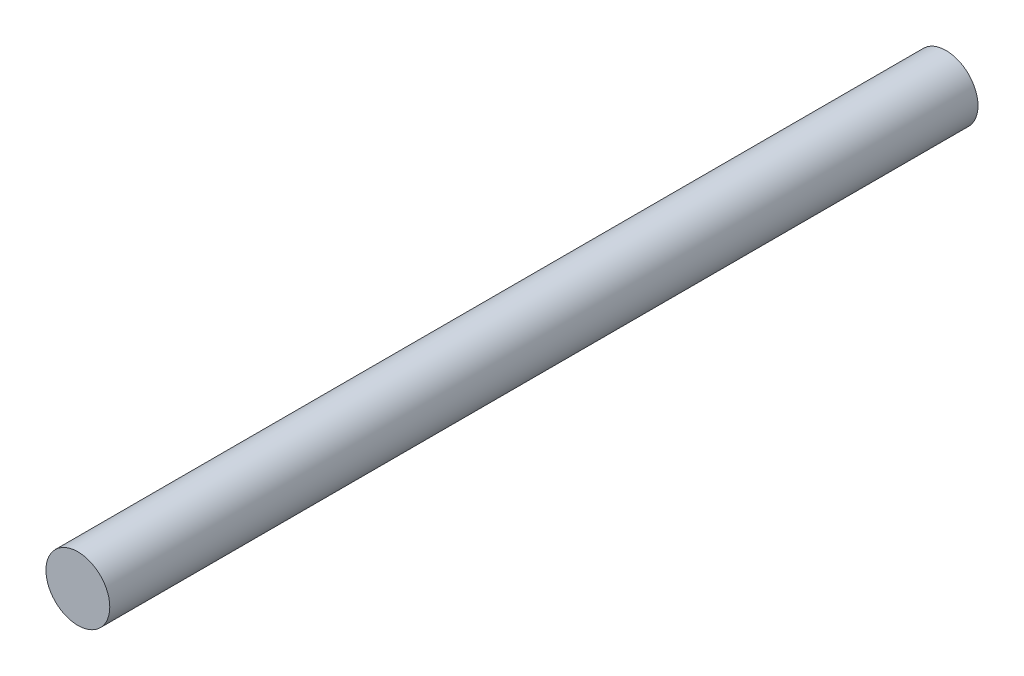
ISO-10303-21;
HEADER;
FILE_DESCRIPTION(('STEP AP214'),'2;1');
FILE_NAME('part.step','',(''),(''),'','','');
FILE_SCHEMA(('AUTOMOTIVE_DESIGN { 1 0 10303 214 1 1 1 1 }'));
ENDSEC;
DATA;
#1=APPLICATION_CONTEXT('core data for automotive mechanical design processes');
#2=APPLICATION_PROTOCOL_DEFINITION('international standard','automotive_design',2000,#1);
#3=PRODUCT_CONTEXT('',#1,'mechanical');
#4=PRODUCT('Part','Part','',(#3));
#5=PRODUCT_RELATED_PRODUCT_CATEGORY('part','',(#4));
#6=PRODUCT_DEFINITION_FORMATION('','',#4);
#7=PRODUCT_DEFINITION_CONTEXT('part definition',#1,'design');
#8=PRODUCT_DEFINITION('design','',#6,#7);
#9=PRODUCT_DEFINITION_SHAPE('','',#8);
#10=(LENGTH_UNIT() NAMED_UNIT(*) SI_UNIT(.MILLI.,.METRE.));
#11=(NAMED_UNIT(*) PLANE_ANGLE_UNIT() SI_UNIT($,.RADIAN.));
#12=(NAMED_UNIT(*) SI_UNIT($,.STERADIAN.) SOLID_ANGLE_UNIT());
#13=UNCERTAINTY_MEASURE_WITH_UNIT(LENGTH_MEASURE(1.E-05),#10,'distance_accuracy_value','');
#14=(GEOMETRIC_REPRESENTATION_CONTEXT(3) GLOBAL_UNCERTAINTY_ASSIGNED_CONTEXT((#13)) GLOBAL_UNIT_ASSIGNED_CONTEXT((#10,
#11,#12)) REPRESENTATION_CONTEXT('',''));
#15=CARTESIAN_POINT('',(0.,0.,0.));
#16=DIRECTION('',(0.,0.,1.));
#17=DIRECTION('',(1.,0.,0.));
#18=AXIS2_PLACEMENT_3D('',#15,#16,#17);
#19=CARTESIAN_POINT('',(0.,0.,68.));
#20=DIRECTION('',(0.,0.,-1.));
#21=DIRECTION('',(-1.,0.,0.));
#22=AXIS2_PLACEMENT_3D('',#19,#20,#21);
#23=CYLINDRICAL_SURFACE('',#22,2.5);
#24=CARTESIAN_POINT('',(0.,0.,68.));
#25=DIRECTION('',(0.,0.,1.));
#26=DIRECTION('',(1.,0.,0.));
#27=AXIS2_PLACEMENT_3D('',#24,#25,#26);
#28=CIRCLE('',#27,2.5);
#29=CARTESIAN_POINT('',(2.5,0.,68.));
#30=VERTEX_POINT('',#29);
#31=EDGE_CURVE('E10',#30,#30,#28,.T.);
#32=ORIENTED_EDGE('',*,*,#31,.F.);
#33=EDGE_LOOP('',(#32));
#34=FACE_BOUND('',#33,.T.);
#35=CARTESIAN_POINT('',(0.,0.,0.));
#36=DIRECTION('',(0.,0.,1.));
#37=DIRECTION('',(1.,0.,0.));
#38=AXIS2_PLACEMENT_3D('',#35,#36,#37);
#39=CIRCLE('',#38,2.5);
#40=CARTESIAN_POINT('',(2.5,0.,0.));
#41=VERTEX_POINT('',#40);
#42=EDGE_CURVE('E34',#41,#41,#39,.T.);
#43=ORIENTED_EDGE('',*,*,#42,.T.);
#44=EDGE_LOOP('',(#43));
#45=FACE_BOUND('',#44,.T.);
#46=ADVANCED_FACE('F31',(#34,#45),#23,.T.);
#47=CARTESIAN_POINT('',(0.,0.,68.));
#48=DIRECTION('',(0.,0.,1.));
#49=DIRECTION('',(1.,0.,0.));
#50=AXIS2_PLACEMENT_3D('',#47,#48,#49);
#51=PLANE('',#50);
#52=ORIENTED_EDGE('',*,*,#31,.T.);
#53=EDGE_LOOP('',(#52));
#54=FACE_BOUND('',#53,.T.);
#55=ADVANCED_FACE('F46',(#54),#51,.T.);
#56=CARTESIAN_POINT('',(0.,0.,0.));
#57=DIRECTION('',(0.,0.,1.));
#58=DIRECTION('',(1.,0.,0.));
#59=AXIS2_PLACEMENT_3D('',#56,#57,#58);
#60=PLANE('',#59);
#61=ORIENTED_EDGE('',*,*,#42,.F.);
#62=EDGE_LOOP('',(#61));
#63=FACE_BOUND('',#62,.T.);
#64=ADVANCED_FACE('F44',(#63),#60,.F.);
#65=CLOSED_SHELL('',(#46,#55,#64));
#66=MANIFOLD_SOLID_BREP('B2',#65);
#67=ADVANCED_BREP_SHAPE_REPRESENTATION('',(#18,#66),#14);
#68=SHAPE_DEFINITION_REPRESENTATION(#9,#67);
ENDSEC;
END-ISO-10303-21;
